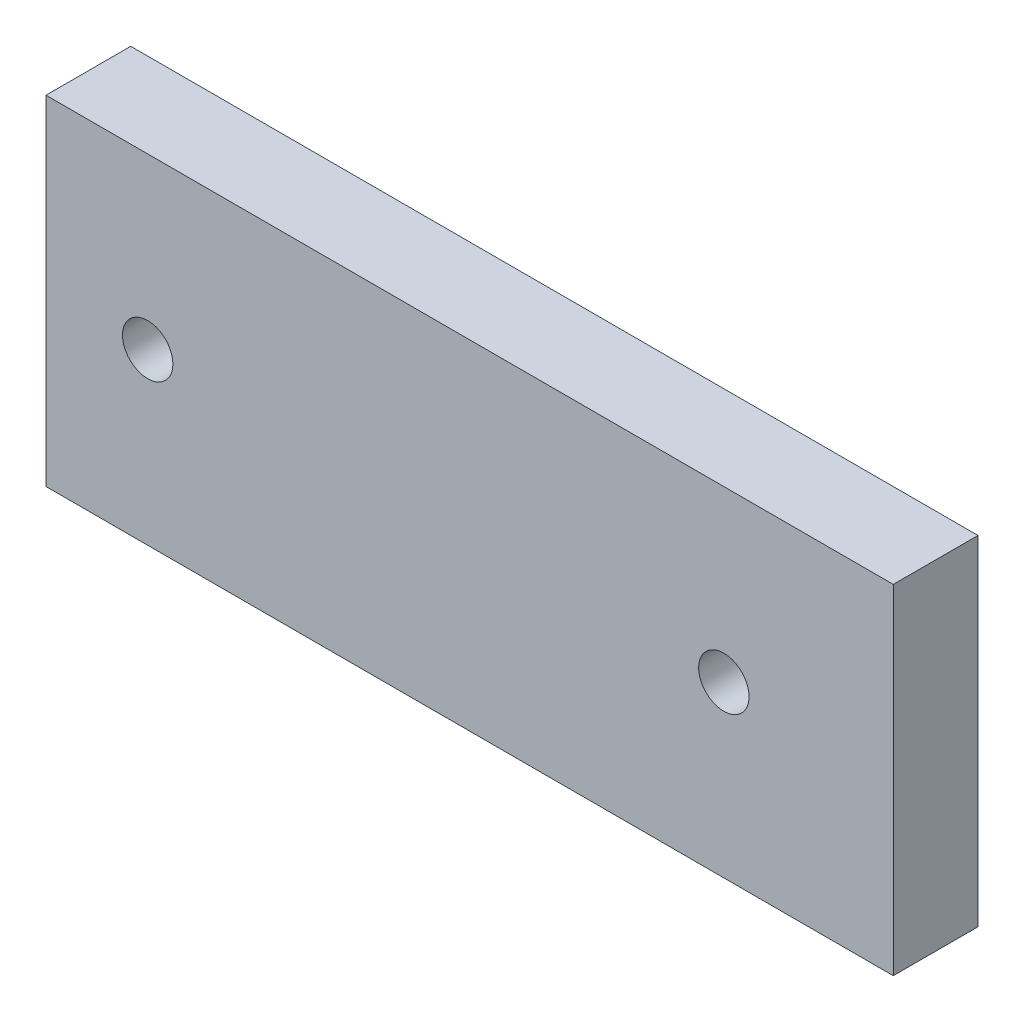
ISO-10303-21;
HEADER;
FILE_DESCRIPTION(('STEP AP214'),'2;1');
FILE_NAME('part.step','',(''),(''),'','','');
FILE_SCHEMA(('AUTOMOTIVE_DESIGN { 1 0 10303 214 1 1 1 1 }'));
ENDSEC;
DATA;
#1=APPLICATION_CONTEXT('core data for automotive mechanical design processes');
#2=APPLICATION_PROTOCOL_DEFINITION('international standard','automotive_design',2000,#1);
#3=PRODUCT_CONTEXT('',#1,'mechanical');
#4=PRODUCT('Part','Part','',(#3));
#5=PRODUCT_RELATED_PRODUCT_CATEGORY('part','',(#4));
#6=PRODUCT_DEFINITION_FORMATION('','',#4);
#7=PRODUCT_DEFINITION_CONTEXT('part definition',#1,'design');
#8=PRODUCT_DEFINITION('design','',#6,#7);
#9=PRODUCT_DEFINITION_SHAPE('','',#8);
#10=(LENGTH_UNIT() NAMED_UNIT(*) SI_UNIT(.MILLI.,.METRE.));
#11=(NAMED_UNIT(*) PLANE_ANGLE_UNIT() SI_UNIT($,.RADIAN.));
#12=(NAMED_UNIT(*) SI_UNIT($,.STERADIAN.) SOLID_ANGLE_UNIT());
#13=UNCERTAINTY_MEASURE_WITH_UNIT(LENGTH_MEASURE(1.E-05),#10,'distance_accuracy_value','');
#14=(GEOMETRIC_REPRESENTATION_CONTEXT(3) GLOBAL_UNCERTAINTY_ASSIGNED_CONTEXT((#13)) GLOBAL_UNIT_ASSIGNED_CONTEXT((#10,
#11,#12)) REPRESENTATION_CONTEXT('',''));
#15=CARTESIAN_POINT('',(0.,0.,0.));
#16=DIRECTION('',(0.,0.,1.));
#17=DIRECTION('',(1.,0.,0.));
#18=AXIS2_PLACEMENT_3D('',#15,#16,#17);
#19=CARTESIAN_POINT('',(-25.,10.,-5.));
#20=DIRECTION('',(-1.,0.,0.));
#21=DIRECTION('',(0.,0.,1.));
#22=AXIS2_PLACEMENT_3D('',#19,#20,#21);
#23=PLANE('',#22);
#24=DIRECTION('',(0.,-1.,0.));
#25=VECTOR('',#24,1.);
#26=CARTESIAN_POINT('',(-25.,10.,0.));
#27=LINE('',#26,#25);
#28=CARTESIAN_POINT('',(-25.,10.,0.));
#29=VERTEX_POINT('',#28);
#30=CARTESIAN_POINT('',(-25.,-10.,0.));
#31=VERTEX_POINT('',#30);
#32=EDGE_CURVE('E97',#29,#31,#27,.T.);
#33=ORIENTED_EDGE('',*,*,#32,.F.);
#34=DIRECTION('',(0.,0.,1.));
#35=VECTOR('',#34,1.);
#36=CARTESIAN_POINT('',(-25.,10.,-5.));
#37=LINE('',#36,#35);
#38=CARTESIAN_POINT('',(-25.,10.,-5.));
#39=VERTEX_POINT('',#38);
#40=EDGE_CURVE('E11',#39,#29,#37,.T.);
#41=ORIENTED_EDGE('',*,*,#40,.F.);
#42=DIRECTION('',(0.,-1.,0.));
#43=VECTOR('',#42,1.);
#44=CARTESIAN_POINT('',(-25.,10.,-5.));
#45=LINE('',#44,#43);
#46=CARTESIAN_POINT('',(-25.,-10.,-5.));
#47=VERTEX_POINT('',#46);
#48=EDGE_CURVE('E90',#39,#47,#45,.T.);
#49=ORIENTED_EDGE('',*,*,#48,.T.);
#50=DIRECTION('',(0.,0.,1.));
#51=VECTOR('',#50,1.);
#52=CARTESIAN_POINT('',(-25.,-10.,-5.));
#53=LINE('',#52,#51);
#54=EDGE_CURVE('E35',#47,#31,#53,.T.);
#55=ORIENTED_EDGE('',*,*,#54,.T.);
#56=EDGE_LOOP('',(#33,#41,#49,#55));
#57=FACE_BOUND('',#56,.T.);
#58=ADVANCED_FACE('F32',(#57),#23,.T.);
#59=CARTESIAN_POINT('',(-25.,10.,-5.));
#60=DIRECTION('',(0.,1.,0.));
#61=DIRECTION('',(-1.,0.,0.));
#62=AXIS2_PLACEMENT_3D('',#59,#60,#61);
#63=PLANE('',#62);
#64=DIRECTION('',(-1.,0.,0.));
#65=VECTOR('',#64,1.);
#66=CARTESIAN_POINT('',(-25.,10.,0.));
#67=LINE('',#66,#65);
#68=CARTESIAN_POINT('',(25.,10.,0.));
#69=VERTEX_POINT('',#68);
#70=EDGE_CURVE('E92',#69,#29,#67,.T.);
#71=ORIENTED_EDGE('',*,*,#70,.F.);
#72=DIRECTION('',(0.,0.,1.));
#73=VECTOR('',#72,1.);
#74=CARTESIAN_POINT('',(25.,10.,-5.));
#75=LINE('',#74,#73);
#76=CARTESIAN_POINT('',(25.,10.,-5.));
#77=VERTEX_POINT('',#76);
#78=EDGE_CURVE('E41',#77,#69,#75,.T.);
#79=ORIENTED_EDGE('',*,*,#78,.F.);
#80=DIRECTION('',(-1.,0.,0.));
#81=VECTOR('',#80,1.);
#82=CARTESIAN_POINT('',(-25.,10.,-5.));
#83=LINE('',#82,#81);
#84=EDGE_CURVE('E87',#77,#39,#83,.T.);
#85=ORIENTED_EDGE('',*,*,#84,.T.);
#86=ORIENTED_EDGE('',*,*,#40,.T.);
#87=EDGE_LOOP('',(#71,#79,#85,#86));
#88=FACE_BOUND('',#87,.T.);
#89=ADVANCED_FACE('F108',(#88),#63,.T.);
#90=CARTESIAN_POINT('',(25.,10.,-5.));
#91=DIRECTION('',(1.,0.,0.));
#92=DIRECTION('',(0.,0.,-1.));
#93=AXIS2_PLACEMENT_3D('',#90,#91,#92);
#94=PLANE('',#93);
#95=DIRECTION('',(0.,1.,0.));
#96=VECTOR('',#95,1.);
#97=CARTESIAN_POINT('',(25.,10.,0.));
#98=LINE('',#97,#96);
#99=CARTESIAN_POINT('',(25.,-10.,0.));
#100=VERTEX_POINT('',#99);
#101=EDGE_CURVE('E82',#100,#69,#98,.T.);
#102=ORIENTED_EDGE('',*,*,#101,.F.);
#103=DIRECTION('',(0.,0.,1.));
#104=VECTOR('',#103,1.);
#105=CARTESIAN_POINT('',(25.,-10.,-5.));
#106=LINE('',#105,#104);
#107=CARTESIAN_POINT('',(25.,-10.,-5.));
#108=VERTEX_POINT('',#107);
#109=EDGE_CURVE('E77',#108,#100,#106,.T.);
#110=ORIENTED_EDGE('',*,*,#109,.F.);
#111=DIRECTION('',(0.,1.,0.));
#112=VECTOR('',#111,1.);
#113=CARTESIAN_POINT('',(25.,10.,-5.));
#114=LINE('',#113,#112);
#115=EDGE_CURVE('E80',#108,#77,#114,.T.);
#116=ORIENTED_EDGE('',*,*,#115,.T.);
#117=ORIENTED_EDGE('',*,*,#78,.T.);
#118=EDGE_LOOP('',(#102,#110,#116,#117));
#119=FACE_BOUND('',#118,.T.);
#120=ADVANCED_FACE('F79',(#119),#94,.T.);
#121=CARTESIAN_POINT('',(-25.,-10.,-5.));
#122=DIRECTION('',(0.,-1.,0.));
#123=DIRECTION('',(1.,0.,0.));
#124=AXIS2_PLACEMENT_3D('',#121,#122,#123);
#125=PLANE('',#124);
#126=DIRECTION('',(1.,0.,0.));
#127=VECTOR('',#126,1.);
#128=CARTESIAN_POINT('',(-25.,-10.,0.));
#129=LINE('',#128,#127);
#130=EDGE_CURVE('E100',#31,#100,#129,.T.);
#131=ORIENTED_EDGE('',*,*,#130,.F.);
#132=ORIENTED_EDGE('',*,*,#54,.F.);
#133=DIRECTION('',(1.,0.,0.));
#134=VECTOR('',#133,1.);
#135=CARTESIAN_POINT('',(-25.,-10.,-5.));
#136=LINE('',#135,#134);
#137=EDGE_CURVE('E86',#47,#108,#136,.T.);
#138=ORIENTED_EDGE('',*,*,#137,.T.);
#139=ORIENTED_EDGE('',*,*,#109,.T.);
#140=EDGE_LOOP('',(#131,#132,#138,#139));
#141=FACE_BOUND('',#140,.T.);
#142=ADVANCED_FACE('F89',(#141),#125,.T.);
#143=CARTESIAN_POINT('',(0.,0.,-5.));
#144=DIRECTION('',(0.,0.,1.));
#145=DIRECTION('',(1.,0.,0.));
#146=AXIS2_PLACEMENT_3D('',#143,#144,#145);
#147=PLANE('',#146);
#148=CARTESIAN_POINT('',(15.,0.,-5.));
#149=DIRECTION('',(0.,0.,1.));
#150=DIRECTION('',(1.,0.,0.));
#151=AXIS2_PLACEMENT_3D('',#148,#149,#150);
#152=CIRCLE('',#151,1.48573677450417);
#153=CARTESIAN_POINT('',(16.4857367745042,0.,-5.));
#154=VERTEX_POINT('',#153);
#155=EDGE_CURVE('E141',#154,#154,#152,.T.);
#156=ORIENTED_EDGE('',*,*,#155,.T.);
#157=EDGE_LOOP('',(#156));
#158=FACE_BOUND('',#157,.T.);
#159=CARTESIAN_POINT('',(-19.,0.,-5.));
#160=DIRECTION('',(0.,0.,1.));
#161=DIRECTION('',(1.,0.,0.));
#162=AXIS2_PLACEMENT_3D('',#159,#160,#161);
#163=CIRCLE('',#162,1.48573677450417);
#164=CARTESIAN_POINT('',(-17.5142632254958,0.,-5.));
#165=VERTEX_POINT('',#164);
#166=EDGE_CURVE('E101',#165,#165,#163,.T.);
#167=ORIENTED_EDGE('',*,*,#166,.T.);
#168=EDGE_LOOP('',(#167));
#169=FACE_BOUND('',#168,.T.);
#170=ORIENTED_EDGE('',*,*,#48,.F.);
#171=ORIENTED_EDGE('',*,*,#84,.F.);
#172=ORIENTED_EDGE('',*,*,#115,.F.);
#173=ORIENTED_EDGE('',*,*,#137,.F.);
#174=EDGE_LOOP('',(#170,#171,#172,#173));
#175=FACE_BOUND('',#174,.T.);
#176=ADVANCED_FACE('F85',(#158,#169,#175),#147,.F.);
#177=CARTESIAN_POINT('',(0.,0.,0.));
#178=DIRECTION('',(0.,0.,1.));
#179=DIRECTION('',(1.,0.,0.));
#180=AXIS2_PLACEMENT_3D('',#177,#178,#179);
#181=PLANE('',#180);
#182=CARTESIAN_POINT('',(15.,0.,0.));
#183=DIRECTION('',(0.,0.,1.));
#184=DIRECTION('',(1.,0.,0.));
#185=AXIS2_PLACEMENT_3D('',#182,#183,#184);
#186=CIRCLE('',#185,1.48573677450417);
#187=CARTESIAN_POINT('',(16.4857367745042,0.,0.));
#188=VERTEX_POINT('',#187);
#189=EDGE_CURVE('E144',#188,#188,#186,.T.);
#190=ORIENTED_EDGE('',*,*,#189,.F.);
#191=EDGE_LOOP('',(#190));
#192=FACE_BOUND('',#191,.T.);
#193=CARTESIAN_POINT('',(-19.,0.,0.));
#194=DIRECTION('',(0.,0.,1.));
#195=DIRECTION('',(1.,0.,0.));
#196=AXIS2_PLACEMENT_3D('',#193,#194,#195);
#197=CIRCLE('',#196,1.48573677450417);
#198=CARTESIAN_POINT('',(-17.5142632254958,0.,0.));
#199=VERTEX_POINT('',#198);
#200=EDGE_CURVE('E146',#199,#199,#197,.T.);
#201=ORIENTED_EDGE('',*,*,#200,.F.);
#202=EDGE_LOOP('',(#201));
#203=FACE_BOUND('',#202,.T.);
#204=ORIENTED_EDGE('',*,*,#32,.T.);
#205=ORIENTED_EDGE('',*,*,#130,.T.);
#206=ORIENTED_EDGE('',*,*,#101,.T.);
#207=ORIENTED_EDGE('',*,*,#70,.T.);
#208=EDGE_LOOP('',(#204,#205,#206,#207));
#209=FACE_BOUND('',#208,.T.);
#210=ADVANCED_FACE('F107',(#192,#203,#209),#181,.T.);
#211=CARTESIAN_POINT('',(-19.,0.,-5.));
#212=DIRECTION('',(0.,0.,1.));
#213=DIRECTION('',(1.,0.,0.));
#214=AXIS2_PLACEMENT_3D('',#211,#212,#213);
#215=CYLINDRICAL_SURFACE('',#214,1.48573677450417);
#216=ORIENTED_EDGE('',*,*,#166,.F.);
#217=EDGE_LOOP('',(#216));
#218=FACE_BOUND('',#217,.T.);
#219=ORIENTED_EDGE('',*,*,#200,.T.);
#220=EDGE_LOOP('',(#219));
#221=FACE_BOUND('',#220,.T.);
#222=ADVANCED_FACE('F126',(#218,#221),#215,.F.);
#223=CARTESIAN_POINT('',(15.,0.,-5.));
#224=DIRECTION('',(0.,0.,1.));
#225=DIRECTION('',(1.,0.,0.));
#226=AXIS2_PLACEMENT_3D('',#223,#224,#225);
#227=CYLINDRICAL_SURFACE('',#226,1.48573677450417);
#228=ORIENTED_EDGE('',*,*,#155,.F.);
#229=EDGE_LOOP('',(#228));
#230=FACE_BOUND('',#229,.T.);
#231=ORIENTED_EDGE('',*,*,#189,.T.);
#232=EDGE_LOOP('',(#231));
#233=FACE_BOUND('',#232,.T.);
#234=ADVANCED_FACE('F133',(#230,#233),#227,.F.);
#235=CLOSED_SHELL('',(#58,#89,#120,#142,#176,#210,#222,#234));
#236=MANIFOLD_SOLID_BREP('B2',#235);
#237=ADVANCED_BREP_SHAPE_REPRESENTATION('',(#18,#236),#14);
#238=SHAPE_DEFINITION_REPRESENTATION(#9,#237);
ENDSEC;
END-ISO-10303-21;
